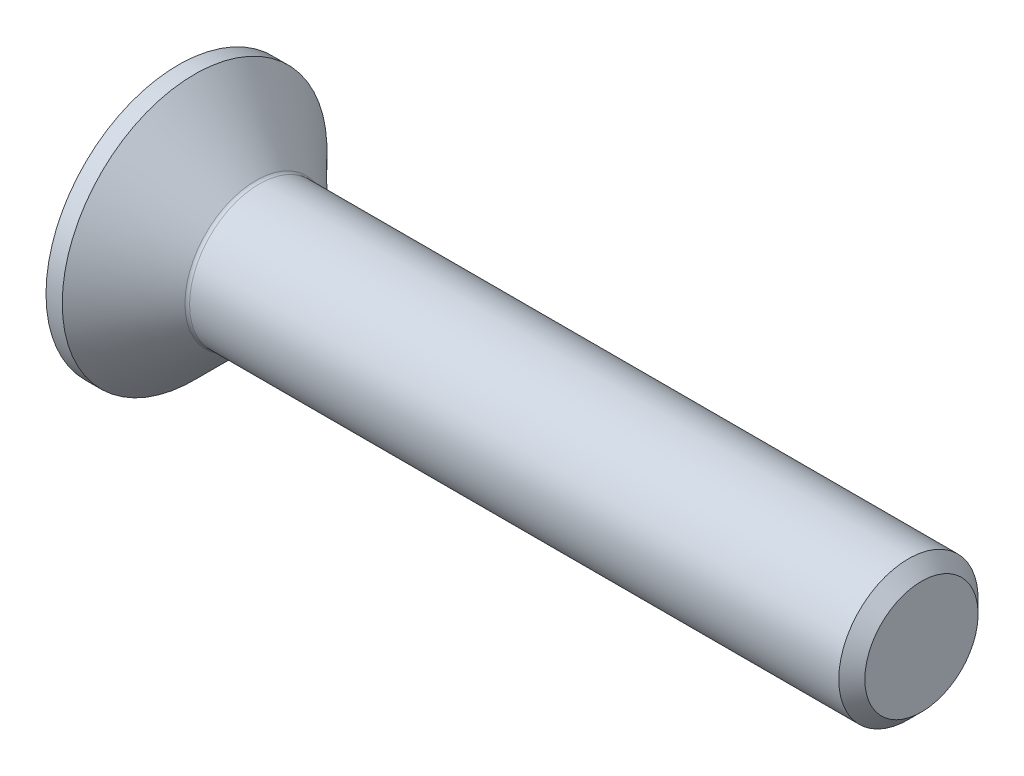
ISO-10303-21;
HEADER;
FILE_DESCRIPTION(('STEP AP214'),'2;1');
FILE_NAME('part.step','',(''),(''),'','','');
FILE_SCHEMA(('AUTOMOTIVE_DESIGN { 1 0 10303 214 1 1 1 1 }'));
ENDSEC;
DATA;
#1=APPLICATION_CONTEXT('core data for automotive mechanical design processes');
#2=APPLICATION_PROTOCOL_DEFINITION('international standard','automotive_design',2000,#1);
#3=PRODUCT_CONTEXT('',#1,'mechanical');
#4=PRODUCT('Part','Part','',(#3));
#5=PRODUCT_RELATED_PRODUCT_CATEGORY('part','',(#4));
#6=PRODUCT_DEFINITION_FORMATION('','',#4);
#7=PRODUCT_DEFINITION_CONTEXT('part definition',#1,'design');
#8=PRODUCT_DEFINITION('design','',#6,#7);
#9=PRODUCT_DEFINITION_SHAPE('','',#8);
#10=(LENGTH_UNIT() NAMED_UNIT(*) SI_UNIT(.MILLI.,.METRE.));
#11=(NAMED_UNIT(*) PLANE_ANGLE_UNIT() SI_UNIT($,.RADIAN.));
#12=(NAMED_UNIT(*) SI_UNIT($,.STERADIAN.) SOLID_ANGLE_UNIT());
#13=UNCERTAINTY_MEASURE_WITH_UNIT(LENGTH_MEASURE(1.E-05),#10,'distance_accuracy_value','');
#14=(GEOMETRIC_REPRESENTATION_CONTEXT(3) GLOBAL_UNCERTAINTY_ASSIGNED_CONTEXT((#13)) GLOBAL_UNIT_ASSIGNED_CONTEXT((#10,
#11,#12)) REPRESENTATION_CONTEXT('',''));
#15=CARTESIAN_POINT('',(0.,0.,0.));
#16=DIRECTION('',(0.,0.,1.));
#17=DIRECTION('',(1.,0.,0.));
#18=AXIS2_PLACEMENT_3D('',#15,#16,#17);
#19=CARTESIAN_POINT('',(0.,0.,0.));
#20=DIRECTION('',(-1.,0.,0.));
#21=DIRECTION('',(0.,0.,1.));
#22=AXIS2_PLACEMENT_3D('',#19,#20,#21);
#23=PLANE('',#22);
#24=CARTESIAN_POINT('',(0.,0.,0.));
#25=DIRECTION('',(-1.,0.,0.));
#26=DIRECTION('',(0.,0.,1.));
#27=AXIS2_PLACEMENT_3D('',#24,#25,#26);
#28=CIRCLE('',#27,2.85);
#29=CARTESIAN_POINT('',(0.,0.,2.85));
#30=VERTEX_POINT('',#29);
#31=EDGE_CURVE('E158',#30,#30,#28,.T.);
#32=ORIENTED_EDGE('',*,*,#31,.T.);
#33=EDGE_LOOP('',(#32));
#34=FACE_BOUND('',#33,.T.);
#35=DIRECTION('',(0.,-0.500000000000005,-0.866025403784435));
#36=VECTOR('',#35,1.);
#37=CARTESIAN_POINT('',(0.,-0.58312377188152,1.01));
#38=LINE('',#37,#36);
#39=CARTESIAN_POINT('',(0.,-0.58312377188152,1.01));
#40=VERTEX_POINT('',#39);
#41=CARTESIAN_POINT('',(0.,-1.16624754376305,0.));
#42=VERTEX_POINT('',#41);
#43=EDGE_CURVE('E120',#40,#42,#38,.T.);
#44=ORIENTED_EDGE('',*,*,#43,.T.);
#45=DIRECTION('',(0.,0.500000000000005,-0.866025403784436));
#46=VECTOR('',#45,1.);
#47=CARTESIAN_POINT('',(0.,-1.16624754376305,0.));
#48=LINE('',#47,#46);
#49=CARTESIAN_POINT('',(0.,-0.583123771881521,-1.01));
#50=VERTEX_POINT('',#49);
#51=EDGE_CURVE('E50',#42,#50,#48,.T.);
#52=ORIENTED_EDGE('',*,*,#51,.T.);
#53=DIRECTION('',(0.,1.,0.));
#54=VECTOR('',#53,1.);
#55=CARTESIAN_POINT('',(0.,-0.583123771881521,-1.01));
#56=LINE('',#55,#54);
#57=CARTESIAN_POINT('',(0.,0.583123771881522,-1.01));
#58=VERTEX_POINT('',#57);
#59=EDGE_CURVE('E135',#50,#58,#56,.T.);
#60=ORIENTED_EDGE('',*,*,#59,.T.);
#61=DIRECTION('',(0.,0.500000000000003,0.866025403784437));
#62=VECTOR('',#61,1.);
#63=CARTESIAN_POINT('',(0.,0.583123771881522,-1.01));
#64=LINE('',#63,#62);
#65=CARTESIAN_POINT('',(0.,1.16624754376305,0.));
#66=VERTEX_POINT('',#65);
#67=EDGE_CURVE('E271',#58,#66,#64,.T.);
#68=ORIENTED_EDGE('',*,*,#67,.T.);
#69=DIRECTION('',(0.,-0.500000000000001,0.866025403784438));
#70=VECTOR('',#69,1.);
#71=CARTESIAN_POINT('',(0.,1.16624754376305,0.));
#72=LINE('',#71,#70);
#73=CARTESIAN_POINT('',(0.,0.583123771881523,1.01));
#74=VERTEX_POINT('',#73);
#75=EDGE_CURVE('E274',#66,#74,#72,.T.);
#76=ORIENTED_EDGE('',*,*,#75,.T.);
#77=DIRECTION('',(0.,-1.,0.));
#78=VECTOR('',#77,1.);
#79=CARTESIAN_POINT('',(0.,0.583123771881523,1.01));
#80=LINE('',#79,#78);
#81=EDGE_CURVE('E277',#74,#40,#80,.T.);
#82=ORIENTED_EDGE('',*,*,#81,.T.);
#83=EDGE_LOOP('',(#44,#52,#60,#68,#76,#82));
#84=FACE_BOUND('',#83,.T.);
#85=ADVANCED_FACE('F35',(#34,#84),#23,.T.);
#86=CARTESIAN_POINT('',(0.,0.,0.));
#87=DIRECTION('',(-1.,0.,0.));
#88=DIRECTION('',(0.,0.,1.));
#89=AXIS2_PLACEMENT_3D('',#86,#87,#88);
#90=CYLINDRICAL_SURFACE('',#89,2.85);
#91=CARTESIAN_POINT('',(0.350000000000015,0.,0.));
#92=DIRECTION('',(-1.,0.,0.));
#93=DIRECTION('',(0.,0.,1.));
#94=AXIS2_PLACEMENT_3D('',#91,#92,#93);
#95=CIRCLE('',#94,2.85);
#96=CARTESIAN_POINT('',(0.350000000000015,0.,2.85));
#97=VERTEX_POINT('',#96);
#98=EDGE_CURVE('E155',#97,#97,#95,.T.);
#99=ORIENTED_EDGE('',*,*,#98,.T.);
#100=EDGE_LOOP('',(#99));
#101=FACE_BOUND('',#100,.T.);
#102=ORIENTED_EDGE('',*,*,#31,.F.);
#103=EDGE_LOOP('',(#102));
#104=FACE_BOUND('',#103,.T.);
#105=ADVANCED_FACE('F179',(#101,#104),#90,.T.);
#106=CARTESIAN_POINT('',(0.350000000000015,0.,0.));
#107=DIRECTION('',(-1.,0.,0.));
#108=DIRECTION('',(0.,0.,1.));
#109=AXIS2_PLACEMENT_3D('',#106,#107,#108);
#110=CONICAL_SURFACE('',#109,2.85,0.785398163397452);
#111=CARTESIAN_POINT('',(1.67071067811869,0.,0.));
#112=DIRECTION('',(-1.,0.,0.));
#113=DIRECTION('',(0.,0.,1.));
#114=AXIS2_PLACEMENT_3D('',#111,#112,#113);
#115=CIRCLE('',#114,1.52928932188132);
#116=CARTESIAN_POINT('',(1.67071067811869,0.,1.52928932188132));
#117=VERTEX_POINT('',#116);
#118=EDGE_CURVE('E43',#117,#117,#115,.T.);
#119=ORIENTED_EDGE('',*,*,#118,.T.);
#120=EDGE_LOOP('',(#119));
#121=FACE_BOUND('',#120,.T.);
#122=ORIENTED_EDGE('',*,*,#98,.F.);
#123=EDGE_LOOP('',(#122));
#124=FACE_BOUND('',#123,.T.);
#125=ADVANCED_FACE('F163',(#121,#124),#110,.T.);
#126=CARTESIAN_POINT('',(0.,0.,0.));
#127=DIRECTION('',(-1.,0.,0.));
#128=DIRECTION('',(0.,0.,1.));
#129=AXIS2_PLACEMENT_3D('',#126,#127,#128);
#130=CYLINDRICAL_SURFACE('',#129,1.49999999999998);
#131=CARTESIAN_POINT('',(1.74142135623734,0.,0.));
#132=DIRECTION('',(-1.,0.,0.));
#133=DIRECTION('',(0.,0.,1.));
#134=AXIS2_PLACEMENT_3D('',#131,#132,#133);
#135=CIRCLE('',#134,1.49999999999998);
#136=CARTESIAN_POINT('',(1.74142135623734,0.,1.49999999999998));
#137=VERTEX_POINT('',#136);
#138=EDGE_CURVE('E11',#137,#137,#135,.F.);
#139=ORIENTED_EDGE('',*,*,#138,.T.);
#140=EDGE_LOOP('',(#139));
#141=FACE_BOUND('',#140,.T.);
#142=CARTESIAN_POINT('',(15.7195,0.,0.));
#143=DIRECTION('',(-1.,0.,0.));
#144=DIRECTION('',(0.,0.,1.));
#145=AXIS2_PLACEMENT_3D('',#142,#143,#144);
#146=CIRCLE('',#145,1.49999999999995);
#147=CARTESIAN_POINT('',(15.7195,0.,1.49999999999995));
#148=VERTEX_POINT('',#147);
#149=EDGE_CURVE('E152',#148,#148,#146,.T.);
#150=ORIENTED_EDGE('',*,*,#149,.T.);
#151=EDGE_LOOP('',(#150));
#152=FACE_BOUND('',#151,.T.);
#153=ADVANCED_FACE('F190',(#141,#152),#130,.T.);
#154=CARTESIAN_POINT('',(16.,0.,0.));
#155=DIRECTION('',(-1.,0.,0.));
#156=DIRECTION('',(0.,0.,1.));
#157=AXIS2_PLACEMENT_3D('',#154,#155,#156);
#158=CONICAL_SURFACE('',#157,1.2195,0.785398163397281);
#159=ORIENTED_EDGE('',*,*,#149,.F.);
#160=EDGE_LOOP('',(#159));
#161=FACE_BOUND('',#160,.T.);
#162=CARTESIAN_POINT('',(16.,0.,0.));
#163=DIRECTION('',(-1.,0.,0.));
#164=DIRECTION('',(0.,0.,1.));
#165=AXIS2_PLACEMENT_3D('',#162,#163,#164);
#166=CIRCLE('',#165,1.2195);
#167=CARTESIAN_POINT('',(16.,0.,1.2195));
#168=VERTEX_POINT('',#167);
#169=EDGE_CURVE('E148',#168,#168,#166,.T.);
#170=ORIENTED_EDGE('',*,*,#169,.T.);
#171=EDGE_LOOP('',(#170));
#172=FACE_BOUND('',#171,.T.);
#173=ADVANCED_FACE('F174',(#161,#172),#158,.T.);
#174=CARTESIAN_POINT('',(16.,1.2195,0.));
#175=DIRECTION('',(1.,0.,0.));
#176=DIRECTION('',(0.,0.,-1.));
#177=AXIS2_PLACEMENT_3D('',#174,#175,#176);
#178=PLANE('',#177);
#179=ORIENTED_EDGE('',*,*,#169,.F.);
#180=EDGE_LOOP('',(#179));
#181=FACE_BOUND('',#180,.T.);
#182=ADVANCED_FACE('F167',(#181),#178,.T.);
#183=CARTESIAN_POINT('',(1.74142135623734,0.,0.));
#184=DIRECTION('',(-1.,0.,0.));
#185=DIRECTION('',(0.,0.,1.));
#186=AXIS2_PLACEMENT_3D('',#183,#184,#185);
#187=TOROIDAL_SURFACE('',#186,1.59999999999998,0.1);
#188=ORIENTED_EDGE('',*,*,#138,.F.);
#189=EDGE_LOOP('',(#188));
#190=FACE_BOUND('',#189,.T.);
#191=ORIENTED_EDGE('',*,*,#118,.F.);
#192=EDGE_LOOP('',(#191));
#193=FACE_BOUND('',#192,.T.);
#194=ADVANCED_FACE('F37',(#190,#193),#187,.F.);
#195=CARTESIAN_POINT('',(1.2,-1.16624754376305,0.));
#196=DIRECTION('',(0.,0.866025403784436,0.500000000000005));
#197=DIRECTION('',(0.,-0.500000000000005,0.866025403784436));
#198=AXIS2_PLACEMENT_3D('',#195,#196,#197);
#199=PLANE('',#198);
#200=ORIENTED_EDGE('',*,*,#51,.F.);
#201=DIRECTION('',(-1.,0.,0.));
#202=VECTOR('',#201,1.);
#203=CARTESIAN_POINT('',(1.2,-1.16624754376305,0.));
#204=LINE('',#203,#202);
#205=CARTESIAN_POINT('',(1.2,-1.16624754376305,0.));
#206=VERTEX_POINT('',#205);
#207=EDGE_CURVE('E268',#206,#42,#204,.T.);
#208=ORIENTED_EDGE('',*,*,#207,.F.);
#209=DIRECTION('',(0.,0.500000000000005,-0.866025403784436));
#210=VECTOR('',#209,1.);
#211=CARTESIAN_POINT('',(1.2,-1.16624754376305,0.));
#212=LINE('',#211,#210);
#213=CARTESIAN_POINT('',(1.2,-0.874685657822283,-0.505000000000006));
#214=VERTEX_POINT('',#213);
#215=EDGE_CURVE('E117',#206,#214,#212,.T.);
#216=ORIENTED_EDGE('',*,*,#215,.T.);
#217=CARTESIAN_POINT('',(1.2,-0.583123771881521,-1.01));
#218=VERTEX_POINT('',#217);
#219=EDGE_CURVE('E111',#214,#218,#212,.T.);
#220=ORIENTED_EDGE('',*,*,#219,.T.);
#221=DIRECTION('',(-1.,0.,0.));
#222=VECTOR('',#221,1.);
#223=CARTESIAN_POINT('',(1.2,-0.583123771881521,-1.01));
#224=LINE('',#223,#222);
#225=EDGE_CURVE('E115',#218,#50,#224,.T.);
#226=ORIENTED_EDGE('',*,*,#225,.T.);
#227=EDGE_LOOP('',(#200,#208,#216,#220,#226));
#228=FACE_BOUND('',#227,.T.);
#229=ADVANCED_FACE('F113',(#228),#199,.T.);
#230=CARTESIAN_POINT('',(1.2,-0.583123771881521,-1.01));
#231=DIRECTION('',(0.,0.,1.));
#232=DIRECTION('',(0.,-1.,0.));
#233=AXIS2_PLACEMENT_3D('',#230,#231,#232);
#234=PLANE('',#233);
#235=ORIENTED_EDGE('',*,*,#59,.F.);
#236=ORIENTED_EDGE('',*,*,#225,.F.);
#237=DIRECTION('',(0.,1.,0.));
#238=VECTOR('',#237,1.);
#239=CARTESIAN_POINT('',(1.2,-0.583123771881521,-1.01));
#240=LINE('',#239,#238);
#241=CARTESIAN_POINT('',(1.2,0.,-1.01));
#242=VERTEX_POINT('',#241);
#243=EDGE_CURVE('E123',#218,#242,#240,.T.);
#244=ORIENTED_EDGE('',*,*,#243,.T.);
#245=CARTESIAN_POINT('',(1.2,0.583123771881522,-1.01));
#246=VERTEX_POINT('',#245);
#247=EDGE_CURVE('E130',#242,#246,#240,.T.);
#248=ORIENTED_EDGE('',*,*,#247,.T.);
#249=DIRECTION('',(-1.,0.,0.));
#250=VECTOR('',#249,1.);
#251=CARTESIAN_POINT('',(1.2,0.583123771881522,-1.01));
#252=LINE('',#251,#250);
#253=EDGE_CURVE('E137',#246,#58,#252,.T.);
#254=ORIENTED_EDGE('',*,*,#253,.T.);
#255=EDGE_LOOP('',(#235,#236,#244,#248,#254));
#256=FACE_BOUND('',#255,.T.);
#257=ADVANCED_FACE('F132',(#256),#234,.T.);
#258=CARTESIAN_POINT('',(1.2,0.583123771881522,-1.01));
#259=DIRECTION('',(0.,-0.866025403784437,0.500000000000003));
#260=DIRECTION('',(0.,-0.500000000000003,-0.866025403784437));
#261=AXIS2_PLACEMENT_3D('',#258,#259,#260);
#262=PLANE('',#261);
#263=ORIENTED_EDGE('',*,*,#67,.F.);
#264=ORIENTED_EDGE('',*,*,#253,.F.);
#265=DIRECTION('',(0.,0.500000000000003,0.866025403784437));
#266=VECTOR('',#265,1.);
#267=CARTESIAN_POINT('',(1.2,0.583123771881522,-1.01));
#268=LINE('',#267,#266);
#269=CARTESIAN_POINT('',(1.2,0.874685657822282,-0.505000000000003));
#270=VERTEX_POINT('',#269);
#271=EDGE_CURVE('E260',#246,#270,#268,.T.);
#272=ORIENTED_EDGE('',*,*,#271,.T.);
#273=CARTESIAN_POINT('',(1.2,1.16624754376305,0.));
#274=VERTEX_POINT('',#273);
#275=EDGE_CURVE('E129',#270,#274,#268,.T.);
#276=ORIENTED_EDGE('',*,*,#275,.T.);
#277=DIRECTION('',(-1.,0.,0.));
#278=VECTOR('',#277,1.);
#279=CARTESIAN_POINT('',(1.2,1.16624754376305,0.));
#280=LINE('',#279,#278);
#281=EDGE_CURVE('E143',#274,#66,#280,.T.);
#282=ORIENTED_EDGE('',*,*,#281,.T.);
#283=EDGE_LOOP('',(#263,#264,#272,#276,#282));
#284=FACE_BOUND('',#283,.T.);
#285=ADVANCED_FACE('F204',(#284),#262,.T.);
#286=CARTESIAN_POINT('',(1.2,1.16624754376305,0.));
#287=DIRECTION('',(0.,-0.866025403784438,-0.500000000000001));
#288=DIRECTION('',(0.,0.500000000000001,-0.866025403784438));
#289=AXIS2_PLACEMENT_3D('',#286,#287,#288);
#290=PLANE('',#289);
#291=ORIENTED_EDGE('',*,*,#75,.F.);
#292=ORIENTED_EDGE('',*,*,#281,.F.);
#293=DIRECTION('',(0.,-0.500000000000001,0.866025403784438));
#294=VECTOR('',#293,1.);
#295=CARTESIAN_POINT('',(1.2,1.16624754376305,0.));
#296=LINE('',#295,#294);
#297=CARTESIAN_POINT('',(1.2,0.874685657822283,0.505000000000001));
#298=VERTEX_POINT('',#297);
#299=EDGE_CURVE('E58',#274,#298,#296,.T.);
#300=ORIENTED_EDGE('',*,*,#299,.T.);
#301=CARTESIAN_POINT('',(1.2,0.583123771881523,1.01));
#302=VERTEX_POINT('',#301);
#303=EDGE_CURVE('E239',#298,#302,#296,.T.);
#304=ORIENTED_EDGE('',*,*,#303,.T.);
#305=DIRECTION('',(-1.,0.,0.));
#306=VECTOR('',#305,1.);
#307=CARTESIAN_POINT('',(1.2,0.583123771881523,1.01));
#308=LINE('',#307,#306);
#309=EDGE_CURVE('E253',#302,#74,#308,.T.);
#310=ORIENTED_EDGE('',*,*,#309,.T.);
#311=EDGE_LOOP('',(#291,#292,#300,#304,#310));
#312=FACE_BOUND('',#311,.T.);
#313=ADVANCED_FACE('F207',(#312),#290,.T.);
#314=CARTESIAN_POINT('',(1.2,0.583123771881523,1.01));
#315=DIRECTION('',(0.,0.,-1.));
#316=DIRECTION('',(0.,1.,0.));
#317=AXIS2_PLACEMENT_3D('',#314,#315,#316);
#318=PLANE('',#317);
#319=ORIENTED_EDGE('',*,*,#81,.F.);
#320=ORIENTED_EDGE('',*,*,#309,.F.);
#321=DIRECTION('',(0.,-1.,0.));
#322=VECTOR('',#321,1.);
#323=CARTESIAN_POINT('',(1.2,0.583123771881523,1.01));
#324=LINE('',#323,#322);
#325=CARTESIAN_POINT('',(1.2,0.,1.01));
#326=VERTEX_POINT('',#325);
#327=EDGE_CURVE('E238',#302,#326,#324,.T.);
#328=ORIENTED_EDGE('',*,*,#327,.T.);
#329=CARTESIAN_POINT('',(1.2,-0.58312377188152,1.01));
#330=VERTEX_POINT('',#329);
#331=EDGE_CURVE('E244',#326,#330,#324,.T.);
#332=ORIENTED_EDGE('',*,*,#331,.T.);
#333=DIRECTION('',(-1.,0.,0.));
#334=VECTOR('',#333,1.);
#335=CARTESIAN_POINT('',(1.2,-0.58312377188152,1.01));
#336=LINE('',#335,#334);
#337=EDGE_CURVE('E283',#330,#40,#336,.T.);
#338=ORIENTED_EDGE('',*,*,#337,.T.);
#339=EDGE_LOOP('',(#319,#320,#328,#332,#338));
#340=FACE_BOUND('',#339,.T.);
#341=ADVANCED_FACE('F211',(#340),#318,.T.);
#342=CARTESIAN_POINT('',(1.2,-0.58312377188152,1.01));
#343=DIRECTION('',(0.,0.866025403784435,-0.500000000000005));
#344=DIRECTION('',(0.,0.500000000000005,0.866025403784436));
#345=AXIS2_PLACEMENT_3D('',#342,#343,#344);
#346=PLANE('',#345);
#347=ORIENTED_EDGE('',*,*,#43,.F.);
#348=ORIENTED_EDGE('',*,*,#337,.F.);
#349=DIRECTION('',(0.,-0.500000000000005,-0.866025403784435));
#350=VECTOR('',#349,1.);
#351=CARTESIAN_POINT('',(1.2,-0.58312377188152,1.01));
#352=LINE('',#351,#350);
#353=CARTESIAN_POINT('',(1.2,-0.874685657822282,0.505000000000007));
#354=VERTEX_POINT('',#353);
#355=EDGE_CURVE('E247',#330,#354,#352,.T.);
#356=ORIENTED_EDGE('',*,*,#355,.T.);
#357=EDGE_CURVE('E254',#354,#206,#352,.T.);
#358=ORIENTED_EDGE('',*,*,#357,.T.);
#359=ORIENTED_EDGE('',*,*,#207,.T.);
#360=EDGE_LOOP('',(#347,#348,#356,#358,#359));
#361=FACE_BOUND('',#360,.T.);
#362=ADVANCED_FACE('F214',(#361),#346,.T.);
#363=CARTESIAN_POINT('',(1.2,-1.16624754376305,0.));
#364=DIRECTION('',(-1.,0.,0.));
#365=DIRECTION('',(0.,0.,1.));
#366=AXIS2_PLACEMENT_3D('',#363,#364,#365);
#367=PLANE('',#366);
#368=CARTESIAN_POINT('',(1.2,0.,0.));
#369=DIRECTION('',(-1.,0.,0.));
#370=DIRECTION('',(0.,0.,1.));
#371=AXIS2_PLACEMENT_3D('',#368,#369,#370);
#372=CIRCLE('',#371,1.01);
#373=EDGE_CURVE('E136',#354,#326,#372,.T.);
#374=ORIENTED_EDGE('',*,*,#373,.F.);
#375=ORIENTED_EDGE('',*,*,#355,.F.);
#376=ORIENTED_EDGE('',*,*,#331,.F.);
#377=EDGE_LOOP('',(#374,#375,#376));
#378=FACE_BOUND('',#377,.T.);
#379=ADVANCED_FACE('F218',(#378),#367,.T.);
#380=EDGE_CURVE('E140',#214,#354,#372,.T.);
#381=ORIENTED_EDGE('',*,*,#380,.F.);
#382=ORIENTED_EDGE('',*,*,#215,.F.);
#383=ORIENTED_EDGE('',*,*,#357,.F.);
#384=EDGE_LOOP('',(#381,#382,#383));
#385=FACE_BOUND('',#384,.T.);
#386=ADVANCED_FACE('F221',(#385),#367,.T.);
#387=EDGE_CURVE('E125',#242,#214,#372,.T.);
#388=ORIENTED_EDGE('',*,*,#387,.F.);
#389=ORIENTED_EDGE('',*,*,#243,.F.);
#390=ORIENTED_EDGE('',*,*,#219,.F.);
#391=EDGE_LOOP('',(#388,#389,#390));
#392=FACE_BOUND('',#391,.T.);
#393=ADVANCED_FACE('F124',(#392),#367,.T.);
#394=EDGE_CURVE('E256',#270,#242,#372,.T.);
#395=ORIENTED_EDGE('',*,*,#394,.F.);
#396=ORIENTED_EDGE('',*,*,#271,.F.);
#397=ORIENTED_EDGE('',*,*,#247,.F.);
#398=EDGE_LOOP('',(#395,#396,#397));
#399=FACE_BOUND('',#398,.T.);
#400=ADVANCED_FACE('F233',(#399),#367,.T.);
#401=EDGE_CURVE('E149',#298,#270,#372,.T.);
#402=ORIENTED_EDGE('',*,*,#401,.F.);
#403=ORIENTED_EDGE('',*,*,#299,.F.);
#404=ORIENTED_EDGE('',*,*,#275,.F.);
#405=EDGE_LOOP('',(#402,#403,#404));
#406=FACE_BOUND('',#405,.T.);
#407=ADVANCED_FACE('F228',(#406),#367,.T.);
#408=EDGE_CURVE('E142',#326,#298,#372,.T.);
#409=ORIENTED_EDGE('',*,*,#408,.F.);
#410=ORIENTED_EDGE('',*,*,#327,.F.);
#411=ORIENTED_EDGE('',*,*,#303,.F.);
#412=EDGE_LOOP('',(#409,#410,#411));
#413=FACE_BOUND('',#412,.T.);
#414=ADVANCED_FACE('F199',(#413),#367,.T.);
#415=CARTESIAN_POINT('',(1.2,0.,0.));
#416=DIRECTION('',(-1.,0.,0.));
#417=DIRECTION('',(0.,0.,1.));
#418=AXIS2_PLACEMENT_3D('',#415,#416,#417);
#419=CONICAL_SURFACE('',#418,1.01,1.04719755119659);
#420=CARTESIAN_POINT('',(1.78312377188153,0.,0.));
#421=VERTEX_POINT('',#420);
#422=VERTEX_LOOP('',#421);
#423=FACE_BOUND('',#422,.T.);
#424=ORIENTED_EDGE('',*,*,#408,.T.);
#425=ORIENTED_EDGE('',*,*,#401,.T.);
#426=ORIENTED_EDGE('',*,*,#394,.T.);
#427=ORIENTED_EDGE('',*,*,#387,.T.);
#428=ORIENTED_EDGE('',*,*,#380,.T.);
#429=ORIENTED_EDGE('',*,*,#373,.T.);
#430=EDGE_LOOP('',(#424,#425,#426,#427,#428,#429));
#431=FACE_BOUND('',#430,.T.);
#432=ADVANCED_FACE('F197',(#423,#431),#419,.F.);
#433=CLOSED_SHELL('',(#85,#105,#125,#153,#173,#182,#194,#229,#257,#285,#313,#341,#362,#379,#386,
#393,#400,#407,#414,#432));
#434=MANIFOLD_SOLID_BREP('B2',#433);
#435=ADVANCED_BREP_SHAPE_REPRESENTATION('',(#18,#434),#14);
#436=SHAPE_DEFINITION_REPRESENTATION(#9,#435);
ENDSEC;
END-ISO-10303-21;
